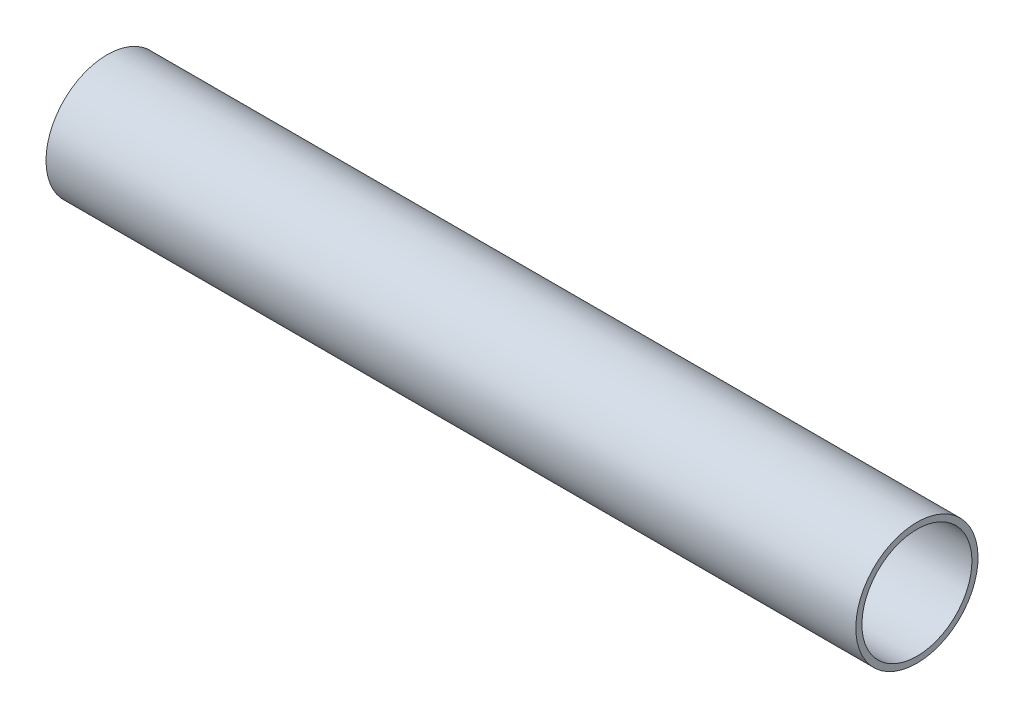
ISO-10303-21;
HEADER;
FILE_DESCRIPTION(('STEP AP214'),'2;1');
FILE_NAME('part.step','',(''),(''),'','','');
FILE_SCHEMA(('AUTOMOTIVE_DESIGN { 1 0 10303 214 1 1 1 1 }'));
ENDSEC;
DATA;
#1=APPLICATION_CONTEXT('core data for automotive mechanical design processes');
#2=APPLICATION_PROTOCOL_DEFINITION('international standard','automotive_design',2000,#1);
#3=PRODUCT_CONTEXT('',#1,'mechanical');
#4=PRODUCT('Part','Part','',(#3));
#5=PRODUCT_RELATED_PRODUCT_CATEGORY('part','',(#4));
#6=PRODUCT_DEFINITION_FORMATION('','',#4);
#7=PRODUCT_DEFINITION_CONTEXT('part definition',#1,'design');
#8=PRODUCT_DEFINITION('design','',#6,#7);
#9=PRODUCT_DEFINITION_SHAPE('','',#8);
#10=(LENGTH_UNIT() NAMED_UNIT(*) SI_UNIT(.MILLI.,.METRE.));
#11=(NAMED_UNIT(*) PLANE_ANGLE_UNIT() SI_UNIT($,.RADIAN.));
#12=(NAMED_UNIT(*) SI_UNIT($,.STERADIAN.) SOLID_ANGLE_UNIT());
#13=UNCERTAINTY_MEASURE_WITH_UNIT(LENGTH_MEASURE(1.E-05),#10,'distance_accuracy_value','');
#14=(GEOMETRIC_REPRESENTATION_CONTEXT(3) GLOBAL_UNCERTAINTY_ASSIGNED_CONTEXT((#13)) GLOBAL_UNIT_ASSIGNED_CONTEXT((#10,
#11,#12)) REPRESENTATION_CONTEXT('',''));
#15=CARTESIAN_POINT('',(0.,0.,0.));
#16=DIRECTION('',(0.,0.,1.));
#17=DIRECTION('',(1.,0.,0.));
#18=AXIS2_PLACEMENT_3D('',#15,#16,#17);
#19=CARTESIAN_POINT('',(167.4495,0.,0.));
#20=DIRECTION('',(-1.,0.,0.));
#21=DIRECTION('',(0.,0.,1.));
#22=AXIS2_PLACEMENT_3D('',#19,#20,#21);
#23=CYLINDRICAL_SURFACE('',#22,14.2875);
#24=CARTESIAN_POINT('',(105.17450009,0.,0.));
#25=DIRECTION('',(-1.,0.,0.));
#26=DIRECTION('',(0.,-1.,0.));
#27=AXIS2_PLACEMENT_3D('',#24,#25,#26);
#28=CIRCLE('',#27,14.2875);
#29=CARTESIAN_POINT('',(105.17450009,-14.2875,0.));
#30=VERTEX_POINT('',#29);
#31=EDGE_CURVE('E51',#30,#30,#28,.T.);
#32=ORIENTED_EDGE('',*,*,#31,.F.);
#33=EDGE_LOOP('',(#32));
#34=FACE_BOUND('',#33,.T.);
#35=CARTESIAN_POINT('',(-105.17450009,0.,0.));
#36=DIRECTION('',(1.,0.,0.));
#37=DIRECTION('',(0.,1.,0.));
#38=AXIS2_PLACEMENT_3D('',#35,#36,#37);
#39=CIRCLE('',#38,14.2875);
#40=CARTESIAN_POINT('',(-105.17450009,14.2875,0.));
#41=VERTEX_POINT('',#40);
#42=EDGE_CURVE('E57',#41,#41,#39,.T.);
#43=ORIENTED_EDGE('',*,*,#42,.F.);
#44=EDGE_LOOP('',(#43));
#45=FACE_BOUND('',#44,.T.);
#46=ADVANCED_FACE('F37',(#34,#45),#23,.F.);
#47=CARTESIAN_POINT('',(-105.17450009,-15.875,-15.875));
#48=DIRECTION('',(1.,0.,0.));
#49=DIRECTION('',(0.,1.,0.));
#50=AXIS2_PLACEMENT_3D('',#47,#48,#49);
#51=PLANE('',#50);
#52=ORIENTED_EDGE('',*,*,#42,.T.);
#53=EDGE_LOOP('',(#52));
#54=FACE_BOUND('',#53,.T.);
#55=CARTESIAN_POINT('',(-105.17450009,0.,0.));
#56=DIRECTION('',(1.,0.,0.));
#57=DIRECTION('',(0.,1.,0.));
#58=AXIS2_PLACEMENT_3D('',#55,#56,#57);
#59=CIRCLE('',#58,15.875);
#60=CARTESIAN_POINT('',(-105.17450009,15.875,0.));
#61=VERTEX_POINT('',#60);
#62=EDGE_CURVE('E10',#61,#61,#59,.T.);
#63=ORIENTED_EDGE('',*,*,#62,.F.);
#64=EDGE_LOOP('',(#63));
#65=FACE_BOUND('',#64,.T.);
#66=ADVANCED_FACE('F65',(#54,#65),#51,.F.);
#67=CARTESIAN_POINT('',(105.17450009,-15.875,-15.875));
#68=DIRECTION('',(-1.,0.,0.));
#69=DIRECTION('',(0.,-1.,0.));
#70=AXIS2_PLACEMENT_3D('',#67,#68,#69);
#71=PLANE('',#70);
#72=ORIENTED_EDGE('',*,*,#31,.T.);
#73=EDGE_LOOP('',(#72));
#74=FACE_BOUND('',#73,.T.);
#75=CARTESIAN_POINT('',(105.17450009,0.,0.));
#76=DIRECTION('',(-1.,0.,0.));
#77=DIRECTION('',(0.,-1.,0.));
#78=AXIS2_PLACEMENT_3D('',#75,#76,#77);
#79=CIRCLE('',#78,15.875);
#80=CARTESIAN_POINT('',(105.17450009,-15.875,0.));
#81=VERTEX_POINT('',#80);
#82=EDGE_CURVE('E45',#81,#81,#79,.T.);
#83=ORIENTED_EDGE('',*,*,#82,.F.);
#84=EDGE_LOOP('',(#83));
#85=FACE_BOUND('',#84,.T.);
#86=ADVANCED_FACE('F73',(#74,#85),#71,.F.);
#87=CARTESIAN_POINT('',(167.4495,0.,0.));
#88=DIRECTION('',(-1.,0.,0.));
#89=DIRECTION('',(0.,0.,1.));
#90=AXIS2_PLACEMENT_3D('',#87,#88,#89);
#91=CYLINDRICAL_SURFACE('',#90,15.875);
#92=ORIENTED_EDGE('',*,*,#82,.T.);
#93=EDGE_LOOP('',(#92));
#94=FACE_BOUND('',#93,.T.);
#95=ORIENTED_EDGE('',*,*,#62,.T.);
#96=EDGE_LOOP('',(#95));
#97=FACE_BOUND('',#96,.T.);
#98=ADVANCED_FACE('F39',(#94,#97),#91,.T.);
#99=CLOSED_SHELL('',(#46,#66,#86,#98));
#100=MANIFOLD_SOLID_BREP('B2',#99);
#101=ADVANCED_BREP_SHAPE_REPRESENTATION('',(#18,#100),#14);
#102=SHAPE_DEFINITION_REPRESENTATION(#9,#101);
ENDSEC;
END-ISO-10303-21;
